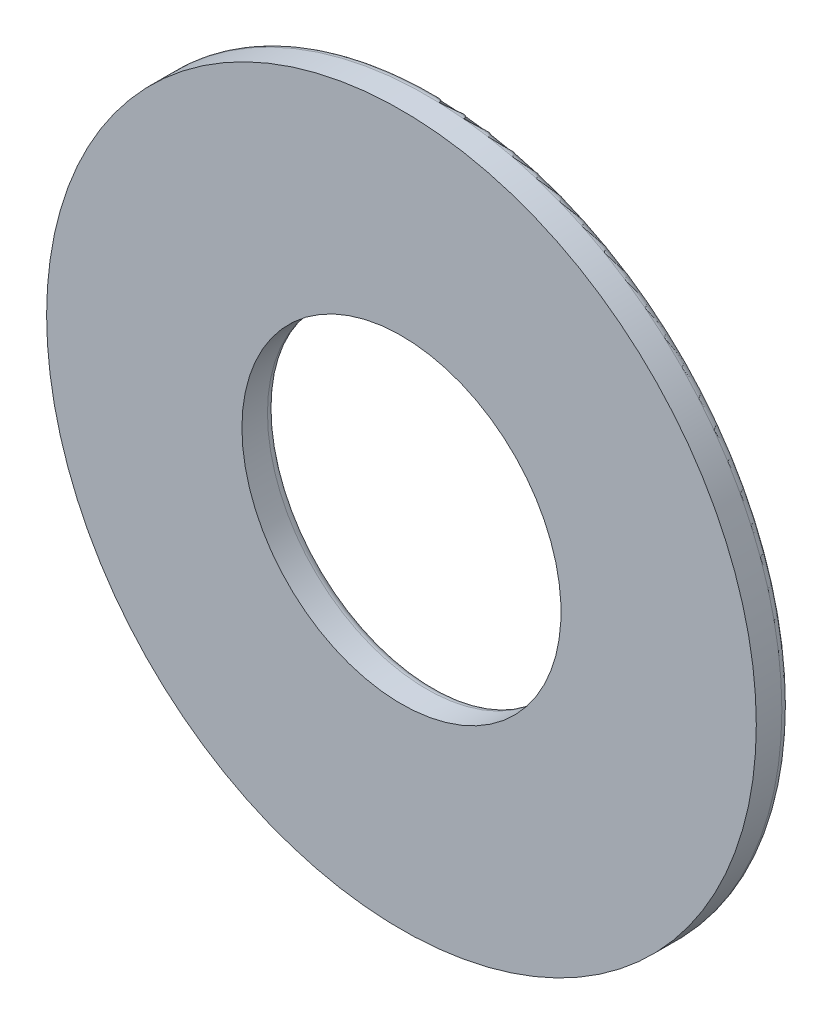
ISO-10303-21;
HEADER;
FILE_DESCRIPTION(('STEP AP214'),'2;1');
FILE_NAME('part.step','',(''),(''),'','','');
FILE_SCHEMA(('AUTOMOTIVE_DESIGN { 1 0 10303 214 1 1 1 1 }'));
ENDSEC;
DATA;
#1=APPLICATION_CONTEXT('core data for automotive mechanical design processes');
#2=APPLICATION_PROTOCOL_DEFINITION('international standard','automotive_design',2000,#1);
#3=PRODUCT_CONTEXT('',#1,'mechanical');
#4=PRODUCT('Part','Part','',(#3));
#5=PRODUCT_RELATED_PRODUCT_CATEGORY('part','',(#4));
#6=PRODUCT_DEFINITION_FORMATION('','',#4);
#7=PRODUCT_DEFINITION_CONTEXT('part definition',#1,'design');
#8=PRODUCT_DEFINITION('design','',#6,#7);
#9=PRODUCT_DEFINITION_SHAPE('','',#8);
#10=(LENGTH_UNIT() NAMED_UNIT(*) SI_UNIT(.MILLI.,.METRE.));
#11=(NAMED_UNIT(*) PLANE_ANGLE_UNIT() SI_UNIT($,.RADIAN.));
#12=(NAMED_UNIT(*) SI_UNIT($,.STERADIAN.) SOLID_ANGLE_UNIT());
#13=UNCERTAINTY_MEASURE_WITH_UNIT(LENGTH_MEASURE(1.E-05),#10,'distance_accuracy_value','');
#14=(GEOMETRIC_REPRESENTATION_CONTEXT(3) GLOBAL_UNCERTAINTY_ASSIGNED_CONTEXT((#13)) GLOBAL_UNIT_ASSIGNED_CONTEXT((#10,
#11,#12)) REPRESENTATION_CONTEXT('',''));
#15=CARTESIAN_POINT('',(0.,0.,0.));
#16=DIRECTION('',(0.,0.,1.));
#17=DIRECTION('',(1.,0.,0.));
#18=AXIS2_PLACEMENT_3D('',#15,#16,#17);
#19=CARTESIAN_POINT('',(0.,0.,-0.381));
#20=DIRECTION('',(0.,0.,-1.));
#21=DIRECTION('',(1.,0.,0.));
#22=AXIS2_PLACEMENT_3D('',#19,#20,#21);
#23=PLANE('',#22);
#24=CARTESIAN_POINT('',(0.,0.,-0.381));
#25=DIRECTION('',(0.,0.,1.));
#26=DIRECTION('',(1.,0.,0.));
#27=AXIS2_PLACEMENT_3D('',#24,#25,#26);
#28=CIRCLE('',#27,7.747);
#29=CARTESIAN_POINT('',(7.747,0.,-0.381));
#30=VERTEX_POINT('',#29);
#31=EDGE_CURVE('E56',#30,#30,#28,.T.);
#32=ORIENTED_EDGE('',*,*,#31,.F.);
#33=EDGE_LOOP('',(#32));
#34=FACE_BOUND('',#33,.T.);
#35=CARTESIAN_POINT('',(0.,0.,-0.381));
#36=DIRECTION('',(0.,0.,1.));
#37=DIRECTION('',(1.,0.,0.));
#38=AXIS2_PLACEMENT_3D('',#35,#36,#37);
#39=CIRCLE('',#38,3.7592);
#40=CARTESIAN_POINT('',(3.7592,0.,-0.381));
#41=VERTEX_POINT('',#40);
#42=EDGE_CURVE('E60',#41,#41,#39,.F.);
#43=ORIENTED_EDGE('',*,*,#42,.F.);
#44=EDGE_LOOP('',(#43));
#45=FACE_BOUND('',#44,.T.);
#46=ADVANCED_FACE('F45',(#34,#45),#23,.T.);
#47=CARTESIAN_POINT('',(0.,0.,-0.381));
#48=DIRECTION('',(0.,0.,1.));
#49=DIRECTION('',(-1.,0.,0.));
#50=AXIS2_PLACEMENT_3D('',#47,#48,#49);
#51=CYLINDRICAL_SURFACE('',#50,7.9375);
#52=CARTESIAN_POINT('',(0.,0.,-0.1905));
#53=DIRECTION('',(0.,0.,1.));
#54=DIRECTION('',(1.,0.,0.));
#55=AXIS2_PLACEMENT_3D('',#52,#53,#54);
#56=CIRCLE('',#55,7.9375);
#57=CARTESIAN_POINT('',(-7.9375,0.,-0.1905));
#58=VERTEX_POINT('',#57);
#59=EDGE_CURVE('E52',#58,#58,#56,.F.);
#60=CARTESIAN_POINT('',(0.,0.,0.381));
#61=DIRECTION('',(0.,0.,1.));
#62=DIRECTION('',(1.,0.,0.));
#63=AXIS2_PLACEMENT_3D('',#60,#61,#62);
#64=CIRCLE('',#63,7.9375);
#65=CARTESIAN_POINT('',(-7.9375,0.,0.381));
#66=VERTEX_POINT('',#65);
#67=EDGE_CURVE('E65',#66,#66,#64,.T.);
#68=CARTESIAN_POINT('',(-7.9375,0.,-0.1905));
#69=CARTESIAN_POINT('',(-7.9375,0.,-0.184546875));
#70=CARTESIAN_POINT('',(-7.9375,0.,-0.17859375));
#71=CARTESIAN_POINT('',(-7.9375,0.,-0.1666875));
#72=CARTESIAN_POINT('',(-7.9375,0.,-0.160734375));
#73=CARTESIAN_POINT('',(-7.9375,0.,-0.148828125));
#74=CARTESIAN_POINT('',(-7.9375,0.,-0.142875));
#75=CARTESIAN_POINT('',(-7.9375,0.,-0.13096875));
#76=CARTESIAN_POINT('',(-7.9375,0.,-0.125015625));
#77=CARTESIAN_POINT('',(-7.9375,0.,-0.113109375));
#78=CARTESIAN_POINT('',(-7.9375,0.,-0.10715625));
#79=CARTESIAN_POINT('',(-7.9375,0.,-0.09525));
#80=CARTESIAN_POINT('',(-7.9375,0.,-0.089296875));
#81=CARTESIAN_POINT('',(-7.9375,0.,-0.077390625));
#82=CARTESIAN_POINT('',(-7.9375,0.,-0.0714375));
#83=CARTESIAN_POINT('',(-7.9375,0.,-0.05953125));
#84=CARTESIAN_POINT('',(-7.9375,0.,-0.053578125));
#85=CARTESIAN_POINT('',(-7.9375,0.,-0.041671875));
#86=CARTESIAN_POINT('',(-7.9375,0.,-0.03571875));
#87=CARTESIAN_POINT('',(-7.9375,0.,-0.0238125));
#88=CARTESIAN_POINT('',(-7.9375,0.,-0.017859375));
#89=CARTESIAN_POINT('',(-7.9375,0.,-0.00595312499999999));
#90=CARTESIAN_POINT('',(-7.9375,0.,0.));
#91=CARTESIAN_POINT('',(-7.9375,0.,0.01190625));
#92=CARTESIAN_POINT('',(-7.9375,0.,0.017859375));
#93=CARTESIAN_POINT('',(-7.9375,0.,0.029765625));
#94=CARTESIAN_POINT('',(-7.9375,0.,0.03571875));
#95=CARTESIAN_POINT('',(-7.9375,0.,0.047625));
#96=CARTESIAN_POINT('',(-7.9375,0.,0.053578125));
#97=CARTESIAN_POINT('',(-7.9375,0.,0.065484375));
#98=CARTESIAN_POINT('',(-7.9375,0.,0.0714375));
#99=CARTESIAN_POINT('',(-7.9375,0.,0.08334375));
#100=CARTESIAN_POINT('',(-7.9375,0.,0.089296875));
#101=CARTESIAN_POINT('',(-7.9375,0.,0.101203125));
#102=CARTESIAN_POINT('',(-7.9375,0.,0.10715625));
#103=CARTESIAN_POINT('',(-7.9375,0.,0.1190625));
#104=CARTESIAN_POINT('',(-7.9375,0.,0.125015625));
#105=CARTESIAN_POINT('',(-7.9375,0.,0.136921875));
#106=CARTESIAN_POINT('',(-7.9375,0.,0.142875));
#107=CARTESIAN_POINT('',(-7.9375,0.,0.15478125));
#108=CARTESIAN_POINT('',(-7.9375,0.,0.160734375));
#109=CARTESIAN_POINT('',(-7.9375,0.,0.172640625));
#110=CARTESIAN_POINT('',(-7.9375,0.,0.17859375));
#111=CARTESIAN_POINT('',(-7.9375,0.,0.1905));
#112=CARTESIAN_POINT('',(-7.9375,0.,0.196453125));
#113=CARTESIAN_POINT('',(-7.9375,0.,0.208359375));
#114=CARTESIAN_POINT('',(-7.9375,0.,0.2143125));
#115=CARTESIAN_POINT('',(-7.9375,0.,0.22621875));
#116=CARTESIAN_POINT('',(-7.9375,0.,0.232171875));
#117=CARTESIAN_POINT('',(-7.9375,0.,0.244078125));
#118=CARTESIAN_POINT('',(-7.9375,0.,0.25003125));
#119=CARTESIAN_POINT('',(-7.9375,0.,0.2619375));
#120=CARTESIAN_POINT('',(-7.9375,0.,0.267890625));
#121=CARTESIAN_POINT('',(-7.9375,0.,0.279796875));
#122=CARTESIAN_POINT('',(-7.9375,0.,0.28575));
#123=CARTESIAN_POINT('',(-7.9375,0.,0.29765625));
#124=CARTESIAN_POINT('',(-7.9375,0.,0.303609375));
#125=CARTESIAN_POINT('',(-7.9375,0.,0.315515625));
#126=CARTESIAN_POINT('',(-7.9375,0.,0.32146875));
#127=CARTESIAN_POINT('',(-7.9375,0.,0.333375));
#128=CARTESIAN_POINT('',(-7.9375,0.,0.339328125));
#129=CARTESIAN_POINT('',(-7.9375,0.,0.351234375));
#130=CARTESIAN_POINT('',(-7.9375,0.,0.3571875));
#131=CARTESIAN_POINT('',(-7.9375,0.,0.36909375));
#132=CARTESIAN_POINT('',(-7.9375,0.,0.375046875));
#133=CARTESIAN_POINT('',(-7.9375,0.,0.381));
#134=B_SPLINE_CURVE_WITH_KNOTS('',3,(#68,#69,#70,#71,#72,#73,#74,#75,#76,#77,#78,#79,#80,#81,
#82,#83,#84,#85,#86,#87,#88,#89,#90,#91,#92,#93,#94,#95,#96,#97,#98,#99,#100,#101,#102,#103,
#104,#105,#106,#107,#108,#109,#110,#111,#112,#113,#114,#115,#116,#117,#118,#119,#120,#121,#122,
#123,#124,#125,#126,#127,#128,#129,#130,#131,#132,#133),.UNSPECIFIED.,.F.,.F.,(4,2,2,2,2,2,2,2,
2,2,2,2,2,2,2,2,2,2,2,2,2,2,2,2,2,2,2,2,2,2,2,2,4),(0.,0.017859375,0.03571875,0.053578125,
0.0714375,0.089296875,0.10715625,0.125015625,0.142875,0.160734375,0.17859375,0.196453125,
0.2143125,0.232171875,0.25003125,0.267890625,0.28575,0.303609375,0.32146875,0.339328125,
0.3571875,0.375046875,0.39290625,0.410765625,0.428625,0.446484375,0.46434375,0.482203125,
0.5000625,0.517921875,0.53578125,0.553640625,0.5715),.UNSPECIFIED.);
#135=EDGE_CURVE('BSEAM81',#58,#66,#134,.T.);
#136=ORIENTED_EDGE('',*,*,#59,.F.);
#137=ORIENTED_EDGE('',*,*,#67,.F.);
#138=ORIENTED_EDGE('',*,*,#135,.T.);
#139=ORIENTED_EDGE('',*,*,#135,.F.);
#140=EDGE_LOOP('',(#136,#138,#137,#139));
#141=FACE_BOUND('',#140,.T.);
#142=ADVANCED_FACE('F81',(#141),#51,.T.);
#143=CARTESIAN_POINT('',(0.,0.,-0.381));
#144=DIRECTION('',(0.,0.,1.));
#145=DIRECTION('',(-1.,0.,0.));
#146=AXIS2_PLACEMENT_3D('',#143,#144,#145);
#147=CYLINDRICAL_SURFACE('',#146,3.5687);
#148=CARTESIAN_POINT('',(0.,0.,-0.1905));
#149=DIRECTION('',(0.,0.,1.));
#150=DIRECTION('',(1.,0.,0.));
#151=AXIS2_PLACEMENT_3D('',#148,#149,#150);
#152=CIRCLE('',#151,3.5687);
#153=CARTESIAN_POINT('',(-3.5687,0.,-0.1905));
#154=VERTEX_POINT('',#153);
#155=EDGE_CURVE('E10',#154,#154,#152,.T.);
#156=CARTESIAN_POINT('',(0.,0.,0.381));
#157=DIRECTION('',(0.,0.,1.));
#158=DIRECTION('',(1.,0.,0.));
#159=AXIS2_PLACEMENT_3D('',#156,#157,#158);
#160=CIRCLE('',#159,3.5687);
#161=CARTESIAN_POINT('',(-3.5687,0.,0.381));
#162=VERTEX_POINT('',#161);
#163=EDGE_CURVE('E68',#162,#162,#160,.T.);
#164=CARTESIAN_POINT('',(-3.5687,0.,-0.1905));
#165=CARTESIAN_POINT('',(-3.5687,0.,-0.184546875));
#166=CARTESIAN_POINT('',(-3.5687,0.,-0.17859375));
#167=CARTESIAN_POINT('',(-3.5687,0.,-0.1666875));
#168=CARTESIAN_POINT('',(-3.5687,0.,-0.160734375));
#169=CARTESIAN_POINT('',(-3.5687,0.,-0.148828125));
#170=CARTESIAN_POINT('',(-3.5687,0.,-0.142875));
#171=CARTESIAN_POINT('',(-3.5687,0.,-0.13096875));
#172=CARTESIAN_POINT('',(-3.5687,0.,-0.125015625));
#173=CARTESIAN_POINT('',(-3.5687,0.,-0.113109375));
#174=CARTESIAN_POINT('',(-3.5687,0.,-0.10715625));
#175=CARTESIAN_POINT('',(-3.5687,0.,-0.09525));
#176=CARTESIAN_POINT('',(-3.5687,0.,-0.089296875));
#177=CARTESIAN_POINT('',(-3.5687,0.,-0.077390625));
#178=CARTESIAN_POINT('',(-3.5687,0.,-0.0714375));
#179=CARTESIAN_POINT('',(-3.5687,0.,-0.05953125));
#180=CARTESIAN_POINT('',(-3.5687,0.,-0.053578125));
#181=CARTESIAN_POINT('',(-3.5687,0.,-0.041671875));
#182=CARTESIAN_POINT('',(-3.5687,0.,-0.03571875));
#183=CARTESIAN_POINT('',(-3.5687,0.,-0.0238125));
#184=CARTESIAN_POINT('',(-3.5687,0.,-0.017859375));
#185=CARTESIAN_POINT('',(-3.5687,0.,-0.00595312499999999));
#186=CARTESIAN_POINT('',(-3.5687,0.,0.));
#187=CARTESIAN_POINT('',(-3.5687,0.,0.01190625));
#188=CARTESIAN_POINT('',(-3.5687,0.,0.017859375));
#189=CARTESIAN_POINT('',(-3.5687,0.,0.029765625));
#190=CARTESIAN_POINT('',(-3.5687,0.,0.03571875));
#191=CARTESIAN_POINT('',(-3.5687,0.,0.047625));
#192=CARTESIAN_POINT('',(-3.5687,0.,0.053578125));
#193=CARTESIAN_POINT('',(-3.5687,0.,0.065484375));
#194=CARTESIAN_POINT('',(-3.5687,0.,0.0714375));
#195=CARTESIAN_POINT('',(-3.5687,0.,0.08334375));
#196=CARTESIAN_POINT('',(-3.5687,0.,0.089296875));
#197=CARTESIAN_POINT('',(-3.5687,0.,0.101203125));
#198=CARTESIAN_POINT('',(-3.5687,0.,0.10715625));
#199=CARTESIAN_POINT('',(-3.5687,0.,0.1190625));
#200=CARTESIAN_POINT('',(-3.5687,0.,0.125015625));
#201=CARTESIAN_POINT('',(-3.5687,0.,0.136921875));
#202=CARTESIAN_POINT('',(-3.5687,0.,0.142875));
#203=CARTESIAN_POINT('',(-3.5687,0.,0.15478125));
#204=CARTESIAN_POINT('',(-3.5687,0.,0.160734375));
#205=CARTESIAN_POINT('',(-3.5687,0.,0.172640625));
#206=CARTESIAN_POINT('',(-3.5687,0.,0.17859375));
#207=CARTESIAN_POINT('',(-3.5687,0.,0.1905));
#208=CARTESIAN_POINT('',(-3.5687,0.,0.196453125));
#209=CARTESIAN_POINT('',(-3.5687,0.,0.208359375));
#210=CARTESIAN_POINT('',(-3.5687,0.,0.2143125));
#211=CARTESIAN_POINT('',(-3.5687,0.,0.22621875));
#212=CARTESIAN_POINT('',(-3.5687,0.,0.232171875));
#213=CARTESIAN_POINT('',(-3.5687,0.,0.244078125));
#214=CARTESIAN_POINT('',(-3.5687,0.,0.25003125));
#215=CARTESIAN_POINT('',(-3.5687,0.,0.2619375));
#216=CARTESIAN_POINT('',(-3.5687,0.,0.267890625));
#217=CARTESIAN_POINT('',(-3.5687,0.,0.279796875));
#218=CARTESIAN_POINT('',(-3.5687,0.,0.28575));
#219=CARTESIAN_POINT('',(-3.5687,0.,0.29765625));
#220=CARTESIAN_POINT('',(-3.5687,0.,0.303609375));
#221=CARTESIAN_POINT('',(-3.5687,0.,0.315515625));
#222=CARTESIAN_POINT('',(-3.5687,0.,0.32146875));
#223=CARTESIAN_POINT('',(-3.5687,0.,0.333375));
#224=CARTESIAN_POINT('',(-3.5687,0.,0.339328125));
#225=CARTESIAN_POINT('',(-3.5687,0.,0.351234375));
#226=CARTESIAN_POINT('',(-3.5687,0.,0.3571875));
#227=CARTESIAN_POINT('',(-3.5687,0.,0.36909375));
#228=CARTESIAN_POINT('',(-3.5687,0.,0.375046875));
#229=CARTESIAN_POINT('',(-3.5687,0.,0.381));
#230=B_SPLINE_CURVE_WITH_KNOTS('',3,(#164,#165,#166,#167,#168,#169,#170,#171,#172,#173,#174,
#175,#176,#177,#178,#179,#180,#181,#182,#183,#184,#185,#186,#187,#188,#189,#190,#191,#192,#193,
#194,#195,#196,#197,#198,#199,#200,#201,#202,#203,#204,#205,#206,#207,#208,#209,#210,#211,#212,
#213,#214,#215,#216,#217,#218,#219,#220,#221,#222,#223,#224,#225,#226,#227,#228,#229),
.UNSPECIFIED.,.F.,.F.,(4,2,2,2,2,2,2,2,2,2,2,2,2,2,2,2,2,2,2,2,2,2,2,2,2,2,2,2,2,2,2,2,4),(0.,
0.017859375,0.03571875,0.053578125,0.0714375,0.089296875,0.10715625,0.125015625,0.142875,
0.160734375,0.17859375,0.196453125,0.2143125,0.232171875,0.25003125,0.267890625,0.28575,
0.303609375,0.32146875,0.339328125,0.3571875,0.375046875,0.39290625,0.410765625,0.428625,
0.446484375,0.46434375,0.482203125,0.5000625,0.517921875,0.53578125,0.553640625,0.5715),.UNSPECIFIED.);
#231=EDGE_CURVE('BSEAM72',#154,#162,#230,.T.);
#232=ORIENTED_EDGE('',*,*,#155,.F.);
#233=ORIENTED_EDGE('',*,*,#163,.T.);
#234=ORIENTED_EDGE('',*,*,#231,.T.);
#235=ORIENTED_EDGE('',*,*,#231,.F.);
#236=EDGE_LOOP('',(#232,#234,#233,#235));
#237=FACE_BOUND('',#236,.T.);
#238=ADVANCED_FACE('F72',(#237),#147,.F.);
#239=CARTESIAN_POINT('',(0.,0.,0.381));
#240=DIRECTION('',(0.,0.,-1.));
#241=DIRECTION('',(1.,0.,0.));
#242=AXIS2_PLACEMENT_3D('',#239,#240,#241);
#243=PLANE('',#242);
#244=ORIENTED_EDGE('',*,*,#163,.F.);
#245=EDGE_LOOP('',(#244));
#246=FACE_BOUND('',#245,.T.);
#247=ORIENTED_EDGE('',*,*,#67,.T.);
#248=EDGE_LOOP('',(#247));
#249=FACE_BOUND('',#248,.T.);
#250=ADVANCED_FACE('F74',(#246,#249),#243,.F.);
#251=CARTESIAN_POINT('',(0.,0.,-0.1905));
#252=DIRECTION('',(0.,0.,-1.));
#253=DIRECTION('',(1.,0.,0.));
#254=AXIS2_PLACEMENT_3D('',#251,#252,#253);
#255=TOROIDAL_SURFACE('',#254,7.747,0.1905);
#256=ORIENTED_EDGE('',*,*,#59,.T.);
#257=EDGE_LOOP('',(#256));
#258=FACE_BOUND('',#257,.T.);
#259=ORIENTED_EDGE('',*,*,#31,.T.);
#260=EDGE_LOOP('',(#259));
#261=FACE_BOUND('',#260,.T.);
#262=ADVANCED_FACE('F77',(#258,#261),#255,.T.);
#263=CARTESIAN_POINT('',(0.,0.,-0.1905));
#264=DIRECTION('',(0.,0.,-1.));
#265=DIRECTION('',(1.,0.,0.));
#266=AXIS2_PLACEMENT_3D('',#263,#264,#265);
#267=TOROIDAL_SURFACE('',#266,3.7592,0.1905);
#268=ORIENTED_EDGE('',*,*,#42,.T.);
#269=EDGE_LOOP('',(#268));
#270=FACE_BOUND('',#269,.T.);
#271=ORIENTED_EDGE('',*,*,#155,.T.);
#272=EDGE_LOOP('',(#271));
#273=FACE_BOUND('',#272,.T.);
#274=ADVANCED_FACE('F47',(#270,#273),#267,.T.);
#275=CLOSED_SHELL('',(#46,#142,#238,#250,#262,#274));
#276=MANIFOLD_SOLID_BREP('B2',#275);
#277=ADVANCED_BREP_SHAPE_REPRESENTATION('',(#18,#276),#14);
#278=SHAPE_DEFINITION_REPRESENTATION(#9,#277);
ENDSEC;
END-ISO-10303-21;
